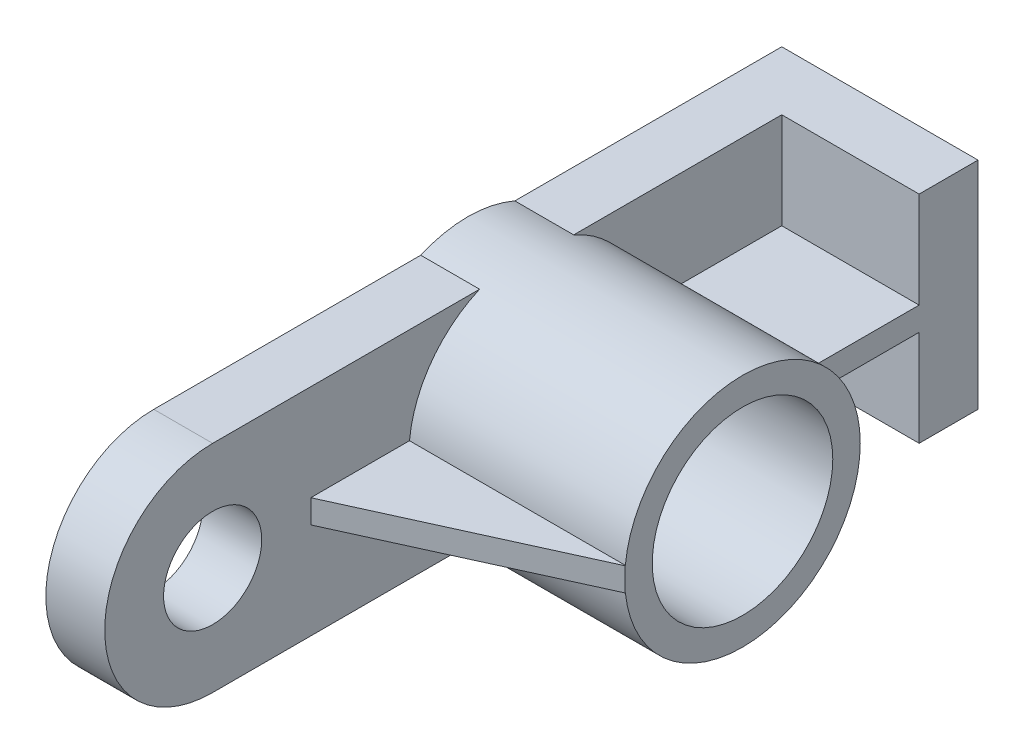
ISO-10303-21;
HEADER;
FILE_DESCRIPTION(('STEP AP214'),'2;1');
FILE_NAME('part.step','',(''),(''),'','','');
FILE_SCHEMA(('AUTOMOTIVE_DESIGN { 1 0 10303 214 1 1 1 1 }'));
ENDSEC;
DATA;
#1=APPLICATION_CONTEXT('core data for automotive mechanical design processes');
#2=APPLICATION_PROTOCOL_DEFINITION('international standard','automotive_design',2000,#1);
#3=PRODUCT_CONTEXT('',#1,'mechanical');
#4=PRODUCT('Part','Part','',(#3));
#5=PRODUCT_RELATED_PRODUCT_CATEGORY('part','',(#4));
#6=PRODUCT_DEFINITION_FORMATION('','',#4);
#7=PRODUCT_DEFINITION_CONTEXT('part definition',#1,'design');
#8=PRODUCT_DEFINITION('design','',#6,#7);
#9=PRODUCT_DEFINITION_SHAPE('','',#8);
#10=(LENGTH_UNIT() NAMED_UNIT(*) SI_UNIT(.MILLI.,.METRE.));
#11=(NAMED_UNIT(*) PLANE_ANGLE_UNIT() SI_UNIT($,.RADIAN.));
#12=(NAMED_UNIT(*) SI_UNIT($,.STERADIAN.) SOLID_ANGLE_UNIT());
#13=UNCERTAINTY_MEASURE_WITH_UNIT(LENGTH_MEASURE(1.E-05),#10,'distance_accuracy_value','');
#14=(GEOMETRIC_REPRESENTATION_CONTEXT(3) GLOBAL_UNCERTAINTY_ASSIGNED_CONTEXT((#13)) GLOBAL_UNIT_ASSIGNED_CONTEXT((#10,
#11,#12)) REPRESENTATION_CONTEXT('',''));
#15=CARTESIAN_POINT('',(0.,0.,0.));
#16=DIRECTION('',(0.,0.,1.));
#17=DIRECTION('',(1.,0.,0.));
#18=AXIS2_PLACEMENT_3D('',#15,#16,#17);
#19=CARTESIAN_POINT('',(15.,0.,79.9999999999998));
#20=DIRECTION('',(-1.,0.,0.));
#21=DIRECTION('',(0.,0.,1.));
#22=AXIS2_PLACEMENT_3D('',#19,#20,#21);
#23=PLANE('',#22);
#24=DIRECTION('',(0.,0.,1.));
#25=VECTOR('',#24,1.);
#26=CARTESIAN_POINT('',(15.,3.,55.));
#27=LINE('',#26,#25);
#28=CARTESIAN_POINT('',(15.,3.,29.8496231131986));
#29=VERTEX_POINT('',#28);
#30=CARTESIAN_POINT('',(15.,3.,55.));
#31=VERTEX_POINT('',#30);
#32=EDGE_CURVE('E187',#29,#31,#27,.T.);
#33=ORIENTED_EDGE('',*,*,#32,.F.);
#34=CARTESIAN_POINT('',(15.,0.,0.));
#35=DIRECTION('',(-1.,0.,0.));
#36=DIRECTION('',(0.,0.,1.));
#37=AXIS2_PLACEMENT_3D('',#34,#35,#36);
#38=CIRCLE('',#37,30.);
#39=CARTESIAN_POINT('',(15.,27.5,11.9895788082817));
#40=VERTEX_POINT('',#39);
#41=EDGE_CURVE('E292',#29,#40,#38,.T.);
#42=ORIENTED_EDGE('',*,*,#41,.T.);
#43=DIRECTION('',(0.,0.,1.));
#44=VECTOR('',#43,1.);
#45=CARTESIAN_POINT('',(15.,27.5,79.9999999999999));
#46=LINE('',#45,#44);
#47=CARTESIAN_POINT('',(15.,27.5,79.9999999999998));
#48=VERTEX_POINT('',#47);
#49=EDGE_CURVE('E319',#40,#48,#46,.T.);
#50=ORIENTED_EDGE('',*,*,#49,.T.);
#51=CARTESIAN_POINT('',(15.,0.,79.9999999999998));
#52=DIRECTION('',(1.,0.,0.));
#53=DIRECTION('',(0.,0.,1.));
#54=AXIS2_PLACEMENT_3D('',#51,#52,#53);
#55=CIRCLE('',#54,27.5);
#56=CARTESIAN_POINT('',(15.,-27.5,79.9999999999998));
#57=VERTEX_POINT('',#56);
#58=EDGE_CURVE('E318',#48,#57,#55,.T.);
#59=ORIENTED_EDGE('',*,*,#58,.T.);
#60=DIRECTION('',(0.,0.,-1.));
#61=VECTOR('',#60,1.);
#62=CARTESIAN_POINT('',(15.,-27.5,79.9999999999998));
#63=LINE('',#62,#61);
#64=CARTESIAN_POINT('',(15.,-27.5,11.9895788082818));
#65=VERTEX_POINT('',#64);
#66=EDGE_CURVE('E323',#57,#65,#63,.T.);
#67=ORIENTED_EDGE('',*,*,#66,.T.);
#68=CARTESIAN_POINT('',(15.,-3.,29.8496231131986));
#69=VERTEX_POINT('',#68);
#70=EDGE_CURVE('E293',#65,#69,#38,.T.);
#71=ORIENTED_EDGE('',*,*,#70,.T.);
#72=DIRECTION('',(0.,0.,1.));
#73=VECTOR('',#72,1.);
#74=CARTESIAN_POINT('',(15.,-3.,55.));
#75=LINE('',#74,#73);
#76=CARTESIAN_POINT('',(15.,-3.,55.));
#77=VERTEX_POINT('',#76);
#78=EDGE_CURVE('E66',#69,#77,#75,.T.);
#79=ORIENTED_EDGE('',*,*,#78,.T.);
#80=DIRECTION('',(0.,-1.,0.));
#81=VECTOR('',#80,1.);
#82=CARTESIAN_POINT('',(15.,3.,55.));
#83=LINE('',#82,#81);
#84=EDGE_CURVE('E61',#31,#77,#83,.T.);
#85=ORIENTED_EDGE('',*,*,#84,.F.);
#86=EDGE_LOOP('',(#33,#42,#50,#59,#67,#71,#79,#85));
#87=FACE_BOUND('',#86,.T.);
#88=CARTESIAN_POINT('',(15.,0.,79.9999999999998));
#89=DIRECTION('',(1.,0.,0.));
#90=DIRECTION('',(0.,0.,-1.));
#91=AXIS2_PLACEMENT_3D('',#88,#89,#90);
#92=CIRCLE('',#91,12.5);
#93=CARTESIAN_POINT('',(15.,0.,67.4999999999998));
#94=VERTEX_POINT('',#93);
#95=EDGE_CURVE('E625',#94,#94,#92,.T.);
#96=ORIENTED_EDGE('',*,*,#95,.F.);
#97=EDGE_LOOP('',(#96));
#98=FACE_BOUND('',#97,.T.);
#99=ADVANCED_FACE('F45',(#87,#98),#23,.F.);
#100=CARTESIAN_POINT('',(0.,0.,0.));
#101=DIRECTION('',(1.,0.,0.));
#102=DIRECTION('',(0.,0.,-1.));
#103=AXIS2_PLACEMENT_3D('',#100,#101,#102);
#104=CYLINDRICAL_SURFACE('',#103,30.);
#105=ORIENTED_EDGE('',*,*,#41,.F.);
#106=DIRECTION('',(1.,0.,0.));
#107=VECTOR('',#106,1.);
#108=CARTESIAN_POINT('',(0.,3.,29.8496231131986));
#109=LINE('',#108,#107);
#110=CARTESIAN_POINT('',(70.,3.,29.8496231131986));
#111=VERTEX_POINT('',#110);
#112=EDGE_CURVE('E215',#29,#111,#109,.T.);
#113=ORIENTED_EDGE('',*,*,#112,.T.);
#114=CARTESIAN_POINT('',(70.,0.,0.));
#115=DIRECTION('',(1.,0.,0.));
#116=DIRECTION('',(0.,0.,-1.));
#117=AXIS2_PLACEMENT_3D('',#114,#115,#116);
#118=CIRCLE('',#117,30.);
#119=CARTESIAN_POINT('',(70.,-3.,29.8496231131986));
#120=VERTEX_POINT('',#119);
#121=EDGE_CURVE('E193',#120,#111,#118,.T.);
#122=ORIENTED_EDGE('',*,*,#121,.F.);
#123=DIRECTION('',(1.,0.,0.));
#124=VECTOR('',#123,1.);
#125=CARTESIAN_POINT('',(0.,-3.,29.8496231131986));
#126=LINE('',#125,#124);
#127=EDGE_CURVE('E211',#69,#120,#126,.T.);
#128=ORIENTED_EDGE('',*,*,#127,.F.);
#129=ORIENTED_EDGE('',*,*,#70,.F.);
#130=DIRECTION('',(1.,0.,0.));
#131=VECTOR('',#130,1.);
#132=CARTESIAN_POINT('',(0.,-27.5,11.9895788082818));
#133=LINE('',#132,#131);
#134=CARTESIAN_POINT('',(0.,-27.5,11.9895788082818));
#135=VERTEX_POINT('',#134);
#136=EDGE_CURVE('E296',#135,#65,#133,.T.);
#137=ORIENTED_EDGE('',*,*,#136,.F.);
#138=CARTESIAN_POINT('',(0.,0.,0.));
#139=DIRECTION('',(1.,0.,0.));
#140=DIRECTION('',(0.,0.,-1.));
#141=AXIS2_PLACEMENT_3D('',#138,#139,#140);
#142=CIRCLE('',#141,30.);
#143=CARTESIAN_POINT('',(0.,-27.5,-11.9895788082818));
#144=VERTEX_POINT('',#143);
#145=EDGE_CURVE('E288',#135,#144,#142,.T.);
#146=ORIENTED_EDGE('',*,*,#145,.T.);
#147=DIRECTION('',(1.,0.,0.));
#148=VECTOR('',#147,1.);
#149=CARTESIAN_POINT('',(0.,-27.5,-11.9895788082818));
#150=LINE('',#149,#148);
#151=CARTESIAN_POINT('',(15.,-27.5,-11.9895788082818));
#152=VERTEX_POINT('',#151);
#153=EDGE_CURVE('E306',#152,#144,#150,.F.);
#154=ORIENTED_EDGE('',*,*,#153,.F.);
#155=CARTESIAN_POINT('',(15.,-3.,-29.8496231131986));
#156=VERTEX_POINT('',#155);
#157=EDGE_CURVE('E305',#156,#152,#38,.T.);
#158=ORIENTED_EDGE('',*,*,#157,.F.);
#159=DIRECTION('',(1.,0.,0.));
#160=VECTOR('',#159,1.);
#161=CARTESIAN_POINT('',(0.,-3.,-29.8496231131986));
#162=LINE('',#161,#160);
#163=CARTESIAN_POINT('',(50.,-3.,-29.8496231131986));
#164=VERTEX_POINT('',#163);
#165=EDGE_CURVE('E233',#156,#164,#162,.T.);
#166=ORIENTED_EDGE('',*,*,#165,.T.);
#167=CARTESIAN_POINT('',(50.,0.,0.));
#168=DIRECTION('',(-1.,0.,0.));
#169=DIRECTION('',(0.,0.,1.));
#170=AXIS2_PLACEMENT_3D('',#167,#168,#169);
#171=CIRCLE('',#170,30.);
#172=CARTESIAN_POINT('',(50.,3.,-29.8496231131986));
#173=VERTEX_POINT('',#172);
#174=EDGE_CURVE('E247',#173,#164,#171,.T.);
#175=ORIENTED_EDGE('',*,*,#174,.F.);
#176=DIRECTION('',(1.,0.,0.));
#177=VECTOR('',#176,1.);
#178=CARTESIAN_POINT('',(0.,3.,-29.8496231131986));
#179=LINE('',#178,#177);
#180=CARTESIAN_POINT('',(15.,3.,-29.8496231131986));
#181=VERTEX_POINT('',#180);
#182=EDGE_CURVE('E244',#181,#173,#179,.T.);
#183=ORIENTED_EDGE('',*,*,#182,.F.);
#184=CARTESIAN_POINT('',(15.,27.5000000000001,-11.9895788082817));
#185=VERTEX_POINT('',#184);
#186=EDGE_CURVE('E297',#185,#181,#38,.T.);
#187=ORIENTED_EDGE('',*,*,#186,.F.);
#188=DIRECTION('',(1.,0.,0.));
#189=VECTOR('',#188,1.);
#190=CARTESIAN_POINT('',(0.,27.5000000000001,-11.9895788082817));
#191=LINE('',#190,#189);
#192=CARTESIAN_POINT('',(0.,27.5000000000001,-11.9895788082817));
#193=VERTEX_POINT('',#192);
#194=EDGE_CURVE('E310',#193,#185,#191,.T.);
#195=ORIENTED_EDGE('',*,*,#194,.F.);
#196=CARTESIAN_POINT('',(0.,27.5,11.9895788082817));
#197=VERTEX_POINT('',#196);
#198=EDGE_CURVE('E289',#193,#197,#142,.T.);
#199=ORIENTED_EDGE('',*,*,#198,.T.);
#200=DIRECTION('',(1.,0.,0.));
#201=VECTOR('',#200,1.);
#202=CARTESIAN_POINT('',(0.,27.5,11.9895788082817));
#203=LINE('',#202,#201);
#204=EDGE_CURVE('E301',#40,#197,#203,.F.);
#205=ORIENTED_EDGE('',*,*,#204,.F.);
#206=EDGE_LOOP('',(#105,#113,#122,#128,#129,#137,#146,#154,#158,#166,#175,#183,#187,#195,#199,#205));
#207=FACE_BOUND('',#206,.T.);
#208=ADVANCED_FACE('F421',(#207),#104,.T.);
#209=DIRECTION('',(0.,0.,-1.));
#210=VECTOR('',#209,1.);
#211=CARTESIAN_POINT('',(15.,-3.,79.9999999999998));
#212=LINE('',#211,#210);
#213=CARTESIAN_POINT('',(15.,-3.,-65.0000000000002));
#214=VERTEX_POINT('',#213);
#215=EDGE_CURVE('E230',#156,#214,#212,.T.);
#216=ORIENTED_EDGE('',*,*,#215,.F.);
#217=ORIENTED_EDGE('',*,*,#157,.T.);
#218=CARTESIAN_POINT('',(15.,-27.5,-65.0000000000002));
#219=VERTEX_POINT('',#218);
#220=EDGE_CURVE('E322',#152,#219,#63,.T.);
#221=ORIENTED_EDGE('',*,*,#220,.T.);
#222=DIRECTION('',(0.,1.,0.));
#223=VECTOR('',#222,1.);
#224=CARTESIAN_POINT('',(15.,0.,-65.0000000000002));
#225=LINE('',#224,#223);
#226=EDGE_CURVE('E274',#219,#214,#225,.T.);
#227=ORIENTED_EDGE('',*,*,#226,.T.);
#228=EDGE_LOOP('',(#216,#217,#221,#227));
#229=FACE_BOUND('',#228,.T.);
#230=ADVANCED_FACE('F397',(#229),#23,.F.);
#231=CARTESIAN_POINT('',(0.,0.,-65.0000000000002));
#232=DIRECTION('',(0.,0.,1.));
#233=DIRECTION('',(0.,-1.,0.));
#234=AXIS2_PLACEMENT_3D('',#231,#232,#233);
#235=PLANE('',#234);
#236=DIRECTION('',(0.,-1.,0.));
#237=VECTOR('',#236,1.);
#238=CARTESIAN_POINT('',(50.,27.5000000000001,-65.0000000000001));
#239=LINE('',#238,#237);
#240=CARTESIAN_POINT('',(50.,-3.,-65.0000000000002));
#241=VERTEX_POINT('',#240);
#242=CARTESIAN_POINT('',(50.,-27.5,-65.0000000000002));
#243=VERTEX_POINT('',#242);
#244=EDGE_CURVE('E254',#241,#243,#239,.T.);
#245=ORIENTED_EDGE('',*,*,#244,.F.);
#246=DIRECTION('',(-1.,0.,0.));
#247=VECTOR('',#246,1.);
#248=CARTESIAN_POINT('',(0.,-3.,-65.0000000000002));
#249=LINE('',#248,#247);
#250=EDGE_CURVE('E223',#241,#214,#249,.T.);
#251=ORIENTED_EDGE('',*,*,#250,.T.);
#252=ORIENTED_EDGE('',*,*,#226,.F.);
#253=DIRECTION('',(-1.,0.,0.));
#254=VECTOR('',#253,1.);
#255=CARTESIAN_POINT('',(0.,-27.5,-65.0000000000002));
#256=LINE('',#255,#254);
#257=EDGE_CURVE('E259',#243,#219,#256,.T.);
#258=ORIENTED_EDGE('',*,*,#257,.F.);
#259=EDGE_LOOP('',(#245,#251,#252,#258));
#260=FACE_BOUND('',#259,.T.);
#261=ADVANCED_FACE('F394',(#260),#235,.T.);
#262=CARTESIAN_POINT('',(15.,27.5,79.9999999999999));
#263=DIRECTION('',(0.,-1.,0.));
#264=DIRECTION('',(0.,0.,-1.));
#265=AXIS2_PLACEMENT_3D('',#262,#263,#264);
#266=PLANE('',#265);
#267=CARTESIAN_POINT('',(15.,27.5000000000001,-65.0000000000002));
#268=VERTEX_POINT('',#267);
#269=EDGE_CURVE('E315',#268,#185,#46,.T.);
#270=ORIENTED_EDGE('',*,*,#269,.F.);
#271=DIRECTION('',(1.,0.,0.));
#272=VECTOR('',#271,1.);
#273=CARTESIAN_POINT('',(0.,27.5000000000001,-65.0000000000001));
#274=LINE('',#273,#272);
#275=CARTESIAN_POINT('',(50.,27.5000000000001,-65.0000000000001));
#276=VERTEX_POINT('',#275);
#277=EDGE_CURVE('E251',#268,#276,#274,.T.);
#278=ORIENTED_EDGE('',*,*,#277,.T.);
#279=DIRECTION('',(0.,0.,-1.));
#280=VECTOR('',#279,1.);
#281=CARTESIAN_POINT('',(50.,27.5000000000001,-65.0000000000001));
#282=LINE('',#281,#280);
#283=CARTESIAN_POINT('',(50.,27.5000000000001,-80.0000000000001));
#284=VERTEX_POINT('',#283);
#285=EDGE_CURVE('E263',#276,#284,#282,.T.);
#286=ORIENTED_EDGE('',*,*,#285,.T.);
#287=DIRECTION('',(-1.,0.,0.));
#288=VECTOR('',#287,1.);
#289=CARTESIAN_POINT('',(15.,27.5000000000001,-80.0000000000001));
#290=LINE('',#289,#288);
#291=CARTESIAN_POINT('',(0.,27.5000000000001,-80.0000000000001));
#292=VERTEX_POINT('',#291);
#293=EDGE_CURVE('E11',#284,#292,#290,.T.);
#294=ORIENTED_EDGE('',*,*,#293,.T.);
#295=DIRECTION('',(0.,0.,1.));
#296=VECTOR('',#295,1.);
#297=CARTESIAN_POINT('',(0.,27.5,79.9999999999999));
#298=LINE('',#297,#296);
#299=EDGE_CURVE('E331',#292,#193,#298,.T.);
#300=ORIENTED_EDGE('',*,*,#299,.T.);
#301=ORIENTED_EDGE('',*,*,#194,.T.);
#302=EDGE_LOOP('',(#270,#278,#286,#294,#300,#301));
#303=FACE_BOUND('',#302,.T.);
#304=ADVANCED_FACE('F423',(#303),#266,.F.);
#305=CARTESIAN_POINT('',(15.,-27.5,79.9999999999998));
#306=DIRECTION('',(0.,1.,0.));
#307=DIRECTION('',(0.,0.,1.));
#308=AXIS2_PLACEMENT_3D('',#305,#306,#307);
#309=PLANE('',#308);
#310=DIRECTION('',(0.,0.,-1.));
#311=VECTOR('',#310,1.);
#312=CARTESIAN_POINT('',(0.,-27.5,79.9999999999998));
#313=LINE('',#312,#311);
#314=CARTESIAN_POINT('',(0.,-27.5,79.9999999999998));
#315=VERTEX_POINT('',#314);
#316=EDGE_CURVE('E338',#315,#135,#313,.T.);
#317=ORIENTED_EDGE('',*,*,#316,.T.);
#318=ORIENTED_EDGE('',*,*,#136,.T.);
#319=ORIENTED_EDGE('',*,*,#66,.F.);
#320=DIRECTION('',(-1.,0.,0.));
#321=VECTOR('',#320,1.);
#322=CARTESIAN_POINT('',(15.,-27.5,79.9999999999998));
#323=LINE('',#322,#321);
#324=EDGE_CURVE('E345',#57,#315,#323,.T.);
#325=ORIENTED_EDGE('',*,*,#324,.T.);
#326=EDGE_LOOP('',(#317,#318,#319,#325));
#327=FACE_BOUND('',#326,.T.);
#328=ADVANCED_FACE('F366',(#327),#309,.F.);
#329=ORIENTED_EDGE('',*,*,#186,.T.);
#330=DIRECTION('',(0.,0.,-1.));
#331=VECTOR('',#330,1.);
#332=CARTESIAN_POINT('',(15.,3.,79.9999999999998));
#333=LINE('',#332,#331);
#334=CARTESIAN_POINT('',(15.,3.,-65.0000000000002));
#335=VERTEX_POINT('',#334);
#336=EDGE_CURVE('E240',#181,#335,#333,.T.);
#337=ORIENTED_EDGE('',*,*,#336,.T.);
#338=EDGE_CURVE('E270',#335,#268,#225,.T.);
#339=ORIENTED_EDGE('',*,*,#338,.T.);
#340=ORIENTED_EDGE('',*,*,#269,.T.);
#341=EDGE_LOOP('',(#329,#337,#339,#340));
#342=FACE_BOUND('',#341,.T.);
#343=ADVANCED_FACE('F417',(#342),#23,.F.);
#344=CARTESIAN_POINT('',(15.,27.5000000000001,-80.0000000000001));
#345=DIRECTION('',(0.,0.,1.));
#346=DIRECTION('',(0.,-1.,0.));
#347=AXIS2_PLACEMENT_3D('',#344,#345,#346);
#348=PLANE('',#347);
#349=DIRECTION('',(0.,-1.,0.));
#350=VECTOR('',#349,1.);
#351=CARTESIAN_POINT('',(50.,27.5000000000001,-80.0000000000001));
#352=LINE('',#351,#350);
#353=CARTESIAN_POINT('',(50.,-27.5,-80.0000000000002));
#354=VERTEX_POINT('',#353);
#355=EDGE_CURVE('E250',#284,#354,#352,.T.);
#356=ORIENTED_EDGE('',*,*,#355,.T.);
#357=DIRECTION('',(-1.,0.,0.));
#358=VECTOR('',#357,1.);
#359=CARTESIAN_POINT('',(15.,-27.5,-80.0000000000002));
#360=LINE('',#359,#358);
#361=CARTESIAN_POINT('',(0.,-27.5,-80.0000000000002));
#362=VERTEX_POINT('',#361);
#363=EDGE_CURVE('E327',#354,#362,#360,.T.);
#364=ORIENTED_EDGE('',*,*,#363,.T.);
#365=DIRECTION('',(0.,1.,0.));
#366=VECTOR('',#365,1.);
#367=CARTESIAN_POINT('',(0.,27.5000000000001,-80.0000000000001));
#368=LINE('',#367,#366);
#369=EDGE_CURVE('E314',#362,#292,#368,.T.);
#370=ORIENTED_EDGE('',*,*,#369,.T.);
#371=ORIENTED_EDGE('',*,*,#293,.F.);
#372=EDGE_LOOP('',(#356,#364,#370,#371));
#373=FACE_BOUND('',#372,.T.);
#374=ADVANCED_FACE('F47',(#373),#348,.F.);
#375=ORIENTED_EDGE('',*,*,#49,.F.);
#376=ORIENTED_EDGE('',*,*,#204,.T.);
#377=CARTESIAN_POINT('',(0.,27.5,79.9999999999998));
#378=VERTEX_POINT('',#377);
#379=EDGE_CURVE('E330',#197,#378,#298,.T.);
#380=ORIENTED_EDGE('',*,*,#379,.T.);
#381=DIRECTION('',(-1.,0.,0.));
#382=VECTOR('',#381,1.);
#383=CARTESIAN_POINT('',(15.,27.5,79.9999999999998));
#384=LINE('',#383,#382);
#385=EDGE_CURVE('E54',#48,#378,#384,.T.);
#386=ORIENTED_EDGE('',*,*,#385,.F.);
#387=EDGE_LOOP('',(#375,#376,#380,#386));
#388=FACE_BOUND('',#387,.T.);
#389=ADVANCED_FACE('F425',(#388),#266,.F.);
#390=CARTESIAN_POINT('',(15.,0.,79.9999999999998));
#391=DIRECTION('',(-1.,0.,0.));
#392=DIRECTION('',(0.,0.,1.));
#393=AXIS2_PLACEMENT_3D('',#390,#391,#392);
#394=CYLINDRICAL_SURFACE('',#393,27.5);
#395=CARTESIAN_POINT('',(0.,0.,79.9999999999998));
#396=DIRECTION('',(1.,0.,0.));
#397=DIRECTION('',(0.,0.,1.));
#398=AXIS2_PLACEMENT_3D('',#395,#396,#397);
#399=CIRCLE('',#398,27.5);
#400=EDGE_CURVE('E334',#378,#315,#399,.T.);
#401=ORIENTED_EDGE('',*,*,#400,.T.);
#402=ORIENTED_EDGE('',*,*,#324,.F.);
#403=ORIENTED_EDGE('',*,*,#58,.F.);
#404=ORIENTED_EDGE('',*,*,#385,.T.);
#405=EDGE_LOOP('',(#401,#402,#403,#404));
#406=FACE_BOUND('',#405,.T.);
#407=ADVANCED_FACE('F354',(#406),#394,.T.);
#408=EDGE_CURVE('E337',#144,#362,#313,.T.);
#409=ORIENTED_EDGE('',*,*,#408,.T.);
#410=ORIENTED_EDGE('',*,*,#363,.F.);
#411=DIRECTION('',(0.,0.,-1.));
#412=VECTOR('',#411,1.);
#413=CARTESIAN_POINT('',(50.,-27.5,-65.0000000000002));
#414=LINE('',#413,#412);
#415=EDGE_CURVE('E266',#243,#354,#414,.T.);
#416=ORIENTED_EDGE('',*,*,#415,.F.);
#417=ORIENTED_EDGE('',*,*,#257,.T.);
#418=ORIENTED_EDGE('',*,*,#220,.F.);
#419=ORIENTED_EDGE('',*,*,#153,.T.);
#420=EDGE_LOOP('',(#409,#410,#416,#417,#418,#419));
#421=FACE_BOUND('',#420,.T.);
#422=ADVANCED_FACE('F391',(#421),#309,.F.);
#423=CARTESIAN_POINT('',(0.,0.,79.9999999999998));
#424=DIRECTION('',(-1.,0.,0.));
#425=DIRECTION('',(0.,0.,1.));
#426=AXIS2_PLACEMENT_3D('',#423,#424,#425);
#427=PLANE('',#426);
#428=CARTESIAN_POINT('',(0.,0.,79.9999999999998));
#429=DIRECTION('',(-1.,0.,0.));
#430=DIRECTION('',(0.,0.,1.));
#431=AXIS2_PLACEMENT_3D('',#428,#429,#430);
#432=CIRCLE('',#431,12.5);
#433=CARTESIAN_POINT('',(0.,0.,92.4999999999999));
#434=VERTEX_POINT('',#433);
#435=EDGE_CURVE('E201',#434,#434,#432,.T.);
#436=ORIENTED_EDGE('',*,*,#435,.F.);
#437=EDGE_LOOP('',(#436));
#438=FACE_BOUND('',#437,.T.);
#439=CARTESIAN_POINT('',(0.,0.,0.));
#440=DIRECTION('',(-1.,0.,0.));
#441=DIRECTION('',(0.,0.,1.));
#442=AXIS2_PLACEMENT_3D('',#439,#440,#441);
#443=CIRCLE('',#442,23.);
#444=CARTESIAN_POINT('',(0.,0.,23.));
#445=VERTEX_POINT('',#444);
#446=EDGE_CURVE('E282',#445,#445,#443,.T.);
#447=ORIENTED_EDGE('',*,*,#446,.F.);
#448=EDGE_LOOP('',(#447));
#449=FACE_BOUND('',#448,.T.);
#450=ORIENTED_EDGE('',*,*,#316,.F.);
#451=ORIENTED_EDGE('',*,*,#400,.F.);
#452=ORIENTED_EDGE('',*,*,#379,.F.);
#453=ORIENTED_EDGE('',*,*,#198,.F.);
#454=ORIENTED_EDGE('',*,*,#299,.F.);
#455=ORIENTED_EDGE('',*,*,#369,.F.);
#456=ORIENTED_EDGE('',*,*,#408,.F.);
#457=ORIENTED_EDGE('',*,*,#145,.F.);
#458=EDGE_LOOP('',(#450,#451,#452,#453,#454,#455,#456,#457));
#459=FACE_BOUND('',#458,.T.);
#460=ADVANCED_FACE('F361',(#438,#449,#459),#427,.T.);
#461=CARTESIAN_POINT('',(70.,0.,0.));
#462=DIRECTION('',(1.,0.,0.));
#463=DIRECTION('',(0.,0.,-1.));
#464=AXIS2_PLACEMENT_3D('',#461,#462,#463);
#465=PLANE('',#464);
#466=ORIENTED_EDGE('',*,*,#121,.T.);
#467=DIRECTION('',(0.,0.,-1.));
#468=VECTOR('',#467,1.);
#469=CARTESIAN_POINT('',(70.,3.,28.));
#470=LINE('',#469,#468);
#471=CARTESIAN_POINT('',(70.,3.,30.));
#472=VERTEX_POINT('',#471);
#473=EDGE_CURVE('E186',#472,#111,#470,.T.);
#474=ORIENTED_EDGE('',*,*,#473,.F.);
#475=DIRECTION('',(0.,-1.,0.));
#476=VECTOR('',#475,1.);
#477=CARTESIAN_POINT('',(70.,3.,30.));
#478=LINE('',#477,#476);
#479=CARTESIAN_POINT('',(70.,-3.,30.));
#480=VERTEX_POINT('',#479);
#481=EDGE_CURVE('E170',#472,#480,#478,.T.);
#482=ORIENTED_EDGE('',*,*,#481,.T.);
#483=DIRECTION('',(0.,0.,-1.));
#484=VECTOR('',#483,1.);
#485=CARTESIAN_POINT('',(70.,-3.,28.));
#486=LINE('',#485,#484);
#487=EDGE_CURVE('E204',#480,#120,#486,.T.);
#488=ORIENTED_EDGE('',*,*,#487,.T.);
#489=EDGE_LOOP('',(#466,#474,#482,#488));
#490=FACE_BOUND('',#489,.T.);
#491=CARTESIAN_POINT('',(70.,0.,0.));
#492=DIRECTION('',(1.,0.,0.));
#493=DIRECTION('',(0.,0.,-1.));
#494=AXIS2_PLACEMENT_3D('',#491,#492,#493);
#495=CIRCLE('',#494,23.);
#496=CARTESIAN_POINT('',(70.,0.,-23.));
#497=VERTEX_POINT('',#496);
#498=EDGE_CURVE('E278',#497,#497,#495,.T.);
#499=ORIENTED_EDGE('',*,*,#498,.F.);
#500=EDGE_LOOP('',(#499));
#501=FACE_BOUND('',#500,.T.);
#502=ADVANCED_FACE('F191',(#490,#501),#465,.T.);
#503=CARTESIAN_POINT('',(70.,0.,0.));
#504=DIRECTION('',(1.,0.,0.));
#505=DIRECTION('',(0.,0.,-1.));
#506=AXIS2_PLACEMENT_3D('',#503,#504,#505);
#507=CYLINDRICAL_SURFACE('',#506,23.);
#508=ORIENTED_EDGE('',*,*,#446,.T.);
#509=EDGE_LOOP('',(#508));
#510=FACE_BOUND('',#509,.T.);
#511=ORIENTED_EDGE('',*,*,#498,.T.);
#512=EDGE_LOOP('',(#511));
#513=FACE_BOUND('',#512,.T.);
#514=ADVANCED_FACE('F464',(#510,#513),#507,.F.);
#515=DIRECTION('',(-1.,0.,0.));
#516=VECTOR('',#515,1.);
#517=CARTESIAN_POINT('',(0.,3.,-65.0000000000002));
#518=LINE('',#517,#516);
#519=CARTESIAN_POINT('',(50.,3.,-65.0000000000001));
#520=VERTEX_POINT('',#519);
#521=EDGE_CURVE('E237',#520,#335,#518,.T.);
#522=ORIENTED_EDGE('',*,*,#521,.F.);
#523=EDGE_CURVE('E255',#276,#520,#239,.T.);
#524=ORIENTED_EDGE('',*,*,#523,.F.);
#525=ORIENTED_EDGE('',*,*,#277,.F.);
#526=ORIENTED_EDGE('',*,*,#338,.F.);
#527=EDGE_LOOP('',(#522,#524,#525,#526));
#528=FACE_BOUND('',#527,.T.);
#529=ADVANCED_FACE('F411',(#528),#235,.T.);
#530=CARTESIAN_POINT('',(50.,27.5000000000001,-65.0000000000001));
#531=DIRECTION('',(1.,0.,0.));
#532=DIRECTION('',(0.,0.,-1.));
#533=AXIS2_PLACEMENT_3D('',#530,#531,#532);
#534=PLANE('',#533);
#535=ORIENTED_EDGE('',*,*,#523,.T.);
#536=DIRECTION('',(0.,0.,1.));
#537=VECTOR('',#536,1.);
#538=CARTESIAN_POINT('',(50.,3.,13.7499999999998));
#539=LINE('',#538,#537);
#540=EDGE_CURVE('E219',#520,#173,#539,.T.);
#541=ORIENTED_EDGE('',*,*,#540,.T.);
#542=ORIENTED_EDGE('',*,*,#174,.T.);
#543=DIRECTION('',(0.,0.,1.));
#544=VECTOR('',#543,1.);
#545=CARTESIAN_POINT('',(50.,-3.,13.7499999999998));
#546=LINE('',#545,#544);
#547=EDGE_CURVE('E218',#241,#164,#546,.T.);
#548=ORIENTED_EDGE('',*,*,#547,.F.);
#549=ORIENTED_EDGE('',*,*,#244,.T.);
#550=ORIENTED_EDGE('',*,*,#415,.T.);
#551=ORIENTED_EDGE('',*,*,#355,.F.);
#552=ORIENTED_EDGE('',*,*,#285,.F.);
#553=EDGE_LOOP('',(#535,#541,#542,#548,#549,#550,#551,#552));
#554=FACE_BOUND('',#553,.T.);
#555=ADVANCED_FACE('F384',(#554),#534,.T.);
#556=CARTESIAN_POINT('',(35.,3.,13.7499999999998));
#557=DIRECTION('',(0.,1.,0.));
#558=DIRECTION('',(0.,0.,1.));
#559=AXIS2_PLACEMENT_3D('',#556,#557,#558);
#560=PLANE('',#559);
#561=ORIENTED_EDGE('',*,*,#336,.F.);
#562=ORIENTED_EDGE('',*,*,#182,.T.);
#563=ORIENTED_EDGE('',*,*,#540,.F.);
#564=ORIENTED_EDGE('',*,*,#521,.T.);
#565=EDGE_LOOP('',(#561,#562,#563,#564));
#566=FACE_BOUND('',#565,.T.);
#567=ADVANCED_FACE('F414',(#566),#560,.T.);
#568=CARTESIAN_POINT('',(35.,-3.,13.7499999999998));
#569=DIRECTION('',(0.,1.,0.));
#570=DIRECTION('',(0.,0.,1.));
#571=AXIS2_PLACEMENT_3D('',#568,#569,#570);
#572=PLANE('',#571);
#573=ORIENTED_EDGE('',*,*,#165,.F.);
#574=ORIENTED_EDGE('',*,*,#215,.T.);
#575=ORIENTED_EDGE('',*,*,#250,.F.);
#576=ORIENTED_EDGE('',*,*,#547,.T.);
#577=EDGE_LOOP('',(#573,#574,#575,#576));
#578=FACE_BOUND('',#577,.T.);
#579=ADVANCED_FACE('F491',(#578),#572,.F.);
#580=CARTESIAN_POINT('',(70.,3.,30.));
#581=DIRECTION('',(-0.413802944301184,0.,-0.910366477462605));
#582=DIRECTION('',(-0.910366477462605,0.,0.413802944301184));
#583=AXIS2_PLACEMENT_3D('',#580,#581,#582);
#584=PLANE('',#583);
#585=DIRECTION('',(0.910366477462605,0.,-0.413802944301184));
#586=VECTOR('',#585,1.);
#587=CARTESIAN_POINT('',(70.,-3.,30.));
#588=LINE('',#587,#586);
#589=EDGE_CURVE('E175',#77,#480,#588,.T.);
#590=ORIENTED_EDGE('',*,*,#589,.T.);
#591=ORIENTED_EDGE('',*,*,#481,.F.);
#592=DIRECTION('',(0.910366477462605,0.,-0.413802944301184));
#593=VECTOR('',#592,1.);
#594=CARTESIAN_POINT('',(70.,3.,30.));
#595=LINE('',#594,#593);
#596=EDGE_CURVE('E173',#31,#472,#595,.T.);
#597=ORIENTED_EDGE('',*,*,#596,.F.);
#598=ORIENTED_EDGE('',*,*,#84,.T.);
#599=EDGE_LOOP('',(#590,#591,#597,#598));
#600=FACE_BOUND('',#599,.T.);
#601=ADVANCED_FACE('F172',(#600),#584,.F.);
#602=CARTESIAN_POINT('',(0.,3.,0.));
#603=DIRECTION('',(0.,-1.,0.));
#604=DIRECTION('',(0.,0.,-1.));
#605=AXIS2_PLACEMENT_3D('',#602,#603,#604);
#606=PLANE('',#605);
#607=ORIENTED_EDGE('',*,*,#112,.F.);
#608=ORIENTED_EDGE('',*,*,#32,.T.);
#609=ORIENTED_EDGE('',*,*,#596,.T.);
#610=ORIENTED_EDGE('',*,*,#473,.T.);
#611=EDGE_LOOP('',(#607,#608,#609,#610));
#612=FACE_BOUND('',#611,.T.);
#613=ADVANCED_FACE('F185',(#612),#606,.F.);
#614=CARTESIAN_POINT('',(0.,-3.,0.));
#615=DIRECTION('',(0.,-1.,0.));
#616=DIRECTION('',(0.,0.,-1.));
#617=AXIS2_PLACEMENT_3D('',#614,#615,#616);
#618=PLANE('',#617);
#619=ORIENTED_EDGE('',*,*,#78,.F.);
#620=ORIENTED_EDGE('',*,*,#127,.T.);
#621=ORIENTED_EDGE('',*,*,#487,.F.);
#622=ORIENTED_EDGE('',*,*,#589,.F.);
#623=EDGE_LOOP('',(#619,#620,#621,#622));
#624=FACE_BOUND('',#623,.T.);
#625=ADVANCED_FACE('F523',(#624),#618,.T.);
#626=CARTESIAN_POINT('',(15.,0.,79.9999999999998));
#627=DIRECTION('',(1.,0.,0.));
#628=DIRECTION('',(0.,0.,-1.));
#629=AXIS2_PLACEMENT_3D('',#626,#627,#628);
#630=CYLINDRICAL_SURFACE('',#629,12.5);
#631=ORIENTED_EDGE('',*,*,#95,.T.);
#632=EDGE_LOOP('',(#631));
#633=FACE_BOUND('',#632,.T.);
#634=ORIENTED_EDGE('',*,*,#435,.T.);
#635=EDGE_LOOP('',(#634));
#636=FACE_BOUND('',#635,.T.);
#637=ADVANCED_FACE('F530',(#633,#636),#630,.F.);
#638=CLOSED_SHELL('',(#99,#208,#230,#261,#304,#328,#343,#374,#389,#407,#422,#460,#502,#514,#529,
#555,#567,#579,#601,#613,#625,#637));
#639=MANIFOLD_SOLID_BREP('B2',#638);
#640=ADVANCED_BREP_SHAPE_REPRESENTATION('',(#18,#639),#14);
#641=SHAPE_DEFINITION_REPRESENTATION(#9,#640);
ENDSEC;
END-ISO-10303-21;
